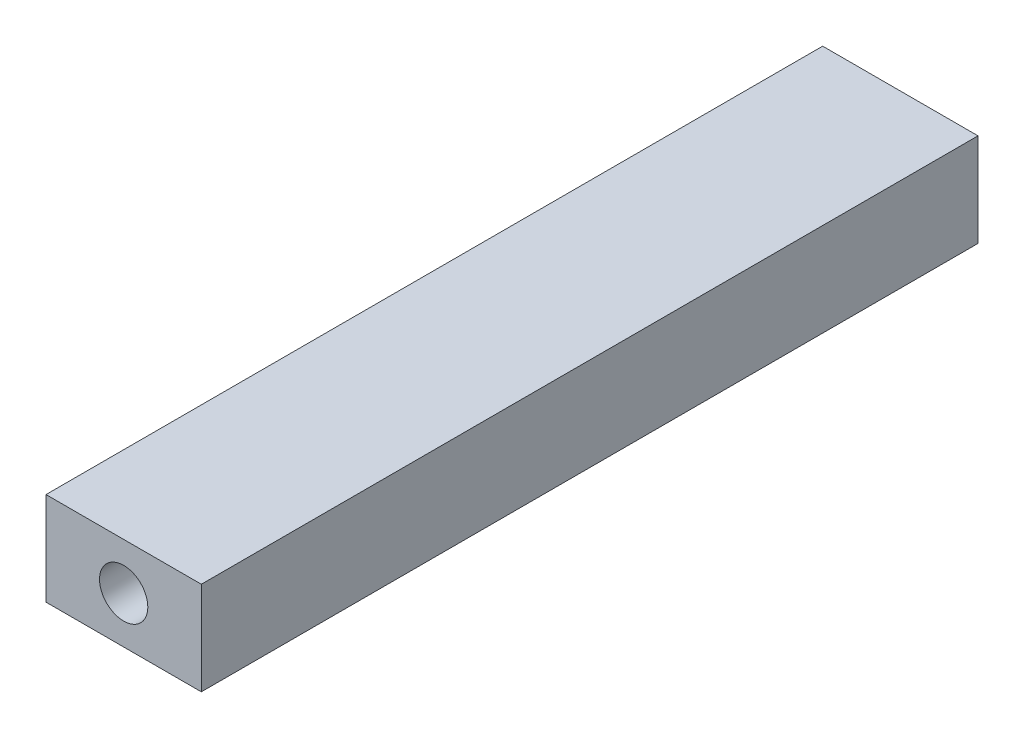
ISO-10303-21;
HEADER;
FILE_DESCRIPTION(('STEP AP214'),'2;1');
FILE_NAME('part.step','',(''),(''),'','','');
FILE_SCHEMA(('AUTOMOTIVE_DESIGN { 1 0 10303 214 1 1 1 1 }'));
ENDSEC;
DATA;
#1=APPLICATION_CONTEXT('core data for automotive mechanical design processes');
#2=APPLICATION_PROTOCOL_DEFINITION('international standard','automotive_design',2000,#1);
#3=PRODUCT_CONTEXT('',#1,'mechanical');
#4=PRODUCT('Part','Part','',(#3));
#5=PRODUCT_RELATED_PRODUCT_CATEGORY('part','',(#4));
#6=PRODUCT_DEFINITION_FORMATION('','',#4);
#7=PRODUCT_DEFINITION_CONTEXT('part definition',#1,'design');
#8=PRODUCT_DEFINITION('design','',#6,#7);
#9=PRODUCT_DEFINITION_SHAPE('','',#8);
#10=(LENGTH_UNIT() NAMED_UNIT(*) SI_UNIT(.MILLI.,.METRE.));
#11=(NAMED_UNIT(*) PLANE_ANGLE_UNIT() SI_UNIT($,.RADIAN.));
#12=(NAMED_UNIT(*) SI_UNIT($,.STERADIAN.) SOLID_ANGLE_UNIT());
#13=UNCERTAINTY_MEASURE_WITH_UNIT(LENGTH_MEASURE(1.E-05),#10,'distance_accuracy_value','');
#14=(GEOMETRIC_REPRESENTATION_CONTEXT(3) GLOBAL_UNCERTAINTY_ASSIGNED_CONTEXT((#13)) GLOBAL_UNIT_ASSIGNED_CONTEXT((#10,
#11,#12)) REPRESENTATION_CONTEXT('',''));
#15=CARTESIAN_POINT('',(0.,0.,0.));
#16=DIRECTION('',(0.,0.,1.));
#17=DIRECTION('',(1.,0.,0.));
#18=AXIS2_PLACEMENT_3D('',#15,#16,#17);
#19=CARTESIAN_POINT('',(0.,0.,500.));
#20=DIRECTION('',(0.,0.,-1.));
#21=DIRECTION('',(-1.,0.,0.));
#22=AXIS2_PLACEMENT_3D('',#19,#20,#21);
#23=PLANE('',#22);
#24=DIRECTION('',(0.,-1.,0.));
#25=VECTOR('',#24,1.);
#26=CARTESIAN_POINT('',(0.,0.,500.));
#27=LINE('',#26,#25);
#28=CARTESIAN_POINT('',(0.,60.,500.));
#29=VERTEX_POINT('',#28);
#30=CARTESIAN_POINT('',(0.,0.,500.));
#31=VERTEX_POINT('',#30);
#32=EDGE_CURVE('E98',#29,#31,#27,.T.);
#33=ORIENTED_EDGE('',*,*,#32,.T.);
#34=DIRECTION('',(1.,0.,0.));
#35=VECTOR('',#34,1.);
#36=CARTESIAN_POINT('',(0.,0.,500.));
#37=LINE('',#36,#35);
#38=CARTESIAN_POINT('',(100.,0.,500.));
#39=VERTEX_POINT('',#38);
#40=EDGE_CURVE('E93',#31,#39,#37,.T.);
#41=ORIENTED_EDGE('',*,*,#40,.T.);
#42=DIRECTION('',(0.,1.,0.));
#43=VECTOR('',#42,1.);
#44=CARTESIAN_POINT('',(100.,0.,500.));
#45=LINE('',#44,#43);
#46=CARTESIAN_POINT('',(100.,60.,500.));
#47=VERTEX_POINT('',#46);
#48=EDGE_CURVE('E96',#39,#47,#45,.T.);
#49=ORIENTED_EDGE('',*,*,#48,.T.);
#50=DIRECTION('',(-1.,0.,0.));
#51=VECTOR('',#50,1.);
#52=CARTESIAN_POINT('',(0.,60.,500.));
#53=LINE('',#52,#51);
#54=EDGE_CURVE('E63',#47,#29,#53,.T.);
#55=ORIENTED_EDGE('',*,*,#54,.T.);
#56=EDGE_LOOP('',(#33,#41,#49,#55));
#57=FACE_BOUND('',#56,.T.);
#58=CARTESIAN_POINT('',(50.,30.,500.));
#59=DIRECTION('',(0.,0.,1.));
#60=DIRECTION('',(1.,0.,0.));
#61=AXIS2_PLACEMENT_3D('',#58,#59,#60);
#62=CIRCLE('',#61,15.5455793938624);
#63=CARTESIAN_POINT('',(65.5455793938624,30.,500.));
#64=VERTEX_POINT('',#63);
#65=EDGE_CURVE('E118',#64,#64,#62,.T.);
#66=ORIENTED_EDGE('',*,*,#65,.F.);
#67=EDGE_LOOP('',(#66));
#68=FACE_BOUND('',#67,.T.);
#69=ADVANCED_FACE('F45',(#57,#68),#23,.F.);
#70=CARTESIAN_POINT('',(0.,0.,0.));
#71=DIRECTION('',(0.,0.,-1.));
#72=DIRECTION('',(-1.,0.,0.));
#73=AXIS2_PLACEMENT_3D('',#70,#71,#72);
#74=PLANE('',#73);
#75=DIRECTION('',(0.,-1.,0.));
#76=VECTOR('',#75,1.);
#77=CARTESIAN_POINT('',(0.,0.,0.));
#78=LINE('',#77,#76);
#79=CARTESIAN_POINT('',(0.,60.,0.));
#80=VERTEX_POINT('',#79);
#81=CARTESIAN_POINT('',(0.,0.,0.));
#82=VERTEX_POINT('',#81);
#83=EDGE_CURVE('E114',#80,#82,#78,.T.);
#84=ORIENTED_EDGE('',*,*,#83,.F.);
#85=DIRECTION('',(-1.,0.,0.));
#86=VECTOR('',#85,1.);
#87=CARTESIAN_POINT('',(0.,60.,0.));
#88=LINE('',#87,#86);
#89=CARTESIAN_POINT('',(100.,60.,0.));
#90=VERTEX_POINT('',#89);
#91=EDGE_CURVE('E86',#90,#80,#88,.T.);
#92=ORIENTED_EDGE('',*,*,#91,.F.);
#93=DIRECTION('',(0.,1.,0.));
#94=VECTOR('',#93,1.);
#95=CARTESIAN_POINT('',(100.,0.,0.));
#96=LINE('',#95,#94);
#97=CARTESIAN_POINT('',(100.,0.,0.));
#98=VERTEX_POINT('',#97);
#99=EDGE_CURVE('E80',#98,#90,#96,.T.);
#100=ORIENTED_EDGE('',*,*,#99,.F.);
#101=DIRECTION('',(1.,0.,0.));
#102=VECTOR('',#101,1.);
#103=CARTESIAN_POINT('',(0.,0.,0.));
#104=LINE('',#103,#102);
#105=EDGE_CURVE('E103',#82,#98,#104,.T.);
#106=ORIENTED_EDGE('',*,*,#105,.F.);
#107=EDGE_LOOP('',(#84,#92,#100,#106));
#108=FACE_BOUND('',#107,.T.);
#109=CARTESIAN_POINT('',(50.,30.,0.));
#110=DIRECTION('',(0.,0.,1.));
#111=DIRECTION('',(1.,0.,0.));
#112=AXIS2_PLACEMENT_3D('',#109,#110,#111);
#113=CIRCLE('',#112,15.5455793938624);
#114=CARTESIAN_POINT('',(65.5455793938624,30.,0.));
#115=VERTEX_POINT('',#114);
#116=EDGE_CURVE('E136',#115,#115,#113,.T.);
#117=ORIENTED_EDGE('',*,*,#116,.T.);
#118=EDGE_LOOP('',(#117));
#119=FACE_BOUND('',#118,.T.);
#120=ADVANCED_FACE('F131',(#108,#119),#74,.T.);
#121=CARTESIAN_POINT('',(0.,0.,500.));
#122=DIRECTION('',(1.,0.,0.));
#123=DIRECTION('',(0.,1.,0.));
#124=AXIS2_PLACEMENT_3D('',#121,#122,#123);
#125=PLANE('',#124);
#126=ORIENTED_EDGE('',*,*,#83,.T.);
#127=DIRECTION('',(0.,0.,-1.));
#128=VECTOR('',#127,1.);
#129=CARTESIAN_POINT('',(0.,0.,500.));
#130=LINE('',#129,#128);
#131=EDGE_CURVE('E11',#31,#82,#130,.T.);
#132=ORIENTED_EDGE('',*,*,#131,.F.);
#133=ORIENTED_EDGE('',*,*,#32,.F.);
#134=DIRECTION('',(0.,0.,-1.));
#135=VECTOR('',#134,1.);
#136=CARTESIAN_POINT('',(0.,60.,500.));
#137=LINE('',#136,#135);
#138=EDGE_CURVE('E110',#29,#80,#137,.T.);
#139=ORIENTED_EDGE('',*,*,#138,.T.);
#140=EDGE_LOOP('',(#126,#132,#133,#139));
#141=FACE_BOUND('',#140,.T.);
#142=ADVANCED_FACE('F47',(#141),#125,.F.);
#143=CARTESIAN_POINT('',(0.,0.,500.));
#144=DIRECTION('',(0.,1.,0.));
#145=DIRECTION('',(0.,0.,1.));
#146=AXIS2_PLACEMENT_3D('',#143,#144,#145);
#147=PLANE('',#146);
#148=ORIENTED_EDGE('',*,*,#105,.T.);
#149=DIRECTION('',(0.,0.,-1.));
#150=VECTOR('',#149,1.);
#151=CARTESIAN_POINT('',(100.,0.,500.));
#152=LINE('',#151,#150);
#153=EDGE_CURVE('E55',#39,#98,#152,.T.);
#154=ORIENTED_EDGE('',*,*,#153,.F.);
#155=ORIENTED_EDGE('',*,*,#40,.F.);
#156=ORIENTED_EDGE('',*,*,#131,.T.);
#157=EDGE_LOOP('',(#148,#154,#155,#156));
#158=FACE_BOUND('',#157,.T.);
#159=ADVANCED_FACE('F102',(#158),#147,.F.);
#160=CARTESIAN_POINT('',(100.,0.,500.));
#161=DIRECTION('',(-1.,0.,0.));
#162=DIRECTION('',(0.,-1.,0.));
#163=AXIS2_PLACEMENT_3D('',#160,#161,#162);
#164=PLANE('',#163);
#165=ORIENTED_EDGE('',*,*,#99,.T.);
#166=DIRECTION('',(0.,0.,-1.));
#167=VECTOR('',#166,1.);
#168=CARTESIAN_POINT('',(100.,60.,500.));
#169=LINE('',#168,#167);
#170=EDGE_CURVE('E105',#47,#90,#169,.T.);
#171=ORIENTED_EDGE('',*,*,#170,.F.);
#172=ORIENTED_EDGE('',*,*,#48,.F.);
#173=ORIENTED_EDGE('',*,*,#153,.T.);
#174=EDGE_LOOP('',(#165,#171,#172,#173));
#175=FACE_BOUND('',#174,.T.);
#176=ADVANCED_FACE('F106',(#175),#164,.F.);
#177=CARTESIAN_POINT('',(0.,60.,500.));
#178=DIRECTION('',(0.,-1.,0.));
#179=DIRECTION('',(0.,0.,-1.));
#180=AXIS2_PLACEMENT_3D('',#177,#178,#179);
#181=PLANE('',#180);
#182=ORIENTED_EDGE('',*,*,#91,.T.);
#183=ORIENTED_EDGE('',*,*,#138,.F.);
#184=ORIENTED_EDGE('',*,*,#54,.F.);
#185=ORIENTED_EDGE('',*,*,#170,.T.);
#186=EDGE_LOOP('',(#182,#183,#184,#185));
#187=FACE_BOUND('',#186,.T.);
#188=ADVANCED_FACE('F128',(#187),#181,.F.);
#189=CARTESIAN_POINT('',(50.,30.,500.));
#190=DIRECTION('',(0.,0.,-1.));
#191=DIRECTION('',(-1.,0.,0.));
#192=AXIS2_PLACEMENT_3D('',#189,#190,#191);
#193=CYLINDRICAL_SURFACE('',#192,15.5455793938624);
#194=ORIENTED_EDGE('',*,*,#65,.T.);
#195=EDGE_LOOP('',(#194));
#196=FACE_BOUND('',#195,.T.);
#197=ORIENTED_EDGE('',*,*,#116,.F.);
#198=EDGE_LOOP('',(#197));
#199=FACE_BOUND('',#198,.T.);
#200=ADVANCED_FACE('F144',(#196,#199),#193,.F.);
#201=CLOSED_SHELL('',(#69,#120,#142,#159,#176,#188,#200));
#202=MANIFOLD_SOLID_BREP('B2',#201);
#203=ADVANCED_BREP_SHAPE_REPRESENTATION('',(#18,#202),#14);
#204=SHAPE_DEFINITION_REPRESENTATION(#9,#203);
ENDSEC;
END-ISO-10303-21;
